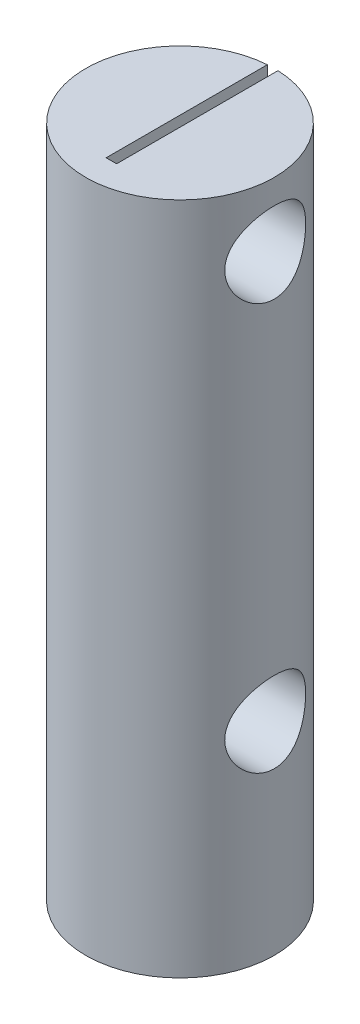
ISO-10303-21;
HEADER;
FILE_DESCRIPTION(('STEP AP214'),'2;1');
FILE_NAME('part.step','',(''),(''),'','','');
FILE_SCHEMA(('AUTOMOTIVE_DESIGN { 1 0 10303 214 1 1 1 1 }'));
ENDSEC;
DATA;
#1=APPLICATION_CONTEXT('core data for automotive mechanical design processes');
#2=APPLICATION_PROTOCOL_DEFINITION('international standard','automotive_design',2000,#1);
#3=PRODUCT_CONTEXT('',#1,'mechanical');
#4=PRODUCT('Part','Part','',(#3));
#5=PRODUCT_RELATED_PRODUCT_CATEGORY('part','',(#4));
#6=PRODUCT_DEFINITION_FORMATION('','',#4);
#7=PRODUCT_DEFINITION_CONTEXT('part definition',#1,'design');
#8=PRODUCT_DEFINITION('design','',#6,#7);
#9=PRODUCT_DEFINITION_SHAPE('','',#8);
#10=(LENGTH_UNIT() NAMED_UNIT(*) SI_UNIT(.MILLI.,.METRE.));
#11=(NAMED_UNIT(*) PLANE_ANGLE_UNIT() SI_UNIT($,.RADIAN.));
#12=(NAMED_UNIT(*) SI_UNIT($,.STERADIAN.) SOLID_ANGLE_UNIT());
#13=UNCERTAINTY_MEASURE_WITH_UNIT(LENGTH_MEASURE(1.E-05),#10,'distance_accuracy_value','');
#14=(GEOMETRIC_REPRESENTATION_CONTEXT(3) GLOBAL_UNCERTAINTY_ASSIGNED_CONTEXT((#13)) GLOBAL_UNIT_ASSIGNED_CONTEXT((#10,
#11,#12)) REPRESENTATION_CONTEXT('',''));
#15=CARTESIAN_POINT('',(0.,0.,0.));
#16=DIRECTION('',(0.,0.,1.));
#17=DIRECTION('',(1.,0.,0.));
#18=AXIS2_PLACEMENT_3D('',#15,#16,#17);
#19=CARTESIAN_POINT('',(0.,50.,0.));
#20=DIRECTION('',(0.,-1.,0.));
#21=DIRECTION('',(0.,0.,-1.));
#22=AXIS2_PLACEMENT_3D('',#19,#20,#21);
#23=CYLINDRICAL_SURFACE('',#22,7.);
#24=CARTESIAN_POINT('',(0.,50.,0.));
#25=DIRECTION('',(0.,1.,0.));
#26=DIRECTION('',(0.,0.,1.));
#27=AXIS2_PLACEMENT_3D('',#24,#25,#26);
#28=CIRCLE('',#27,7.);
#29=CARTESIAN_POINT('',(-0.499999999999999,50.,-6.98212002188447));
#30=VERTEX_POINT('',#29);
#31=CARTESIAN_POINT('',(0.27608075124194,50.,-6.99455355392992));
#32=VERTEX_POINT('',#31);
#33=EDGE_CURVE('E104',#30,#32,#28,.T.);
#34=ORIENTED_EDGE('',*,*,#33,.F.);
#35=DIRECTION('',(0.,-1.,0.));
#36=VECTOR('',#35,1.);
#37=CARTESIAN_POINT('',(-0.499999999999999,50.,-6.98212002188447));
#38=LINE('',#37,#36);
#39=CARTESIAN_POINT('',(-0.499999999999999,0.,-6.98212002188447));
#40=VERTEX_POINT('',#39);
#41=EDGE_CURVE('E79',#30,#40,#38,.T.);
#42=ORIENTED_EDGE('',*,*,#41,.T.);
#43=CARTESIAN_POINT('',(0.,0.,0.));
#44=DIRECTION('',(0.,1.,0.));
#45=DIRECTION('',(0.,0.,1.));
#46=AXIS2_PLACEMENT_3D('',#43,#44,#45);
#47=CIRCLE('',#46,7.);
#48=CARTESIAN_POINT('',(0.27608075124194,0.,-6.99455355392992));
#49=VERTEX_POINT('',#48);
#50=EDGE_CURVE('E103',#40,#49,#47,.T.);
#51=ORIENTED_EDGE('',*,*,#50,.T.);
#52=DIRECTION('',(0.,-1.,0.));
#53=VECTOR('',#52,1.);
#54=CARTESIAN_POINT('',(0.27608075124194,50.,-6.99455355392992));
#55=LINE('',#54,#53);
#56=EDGE_CURVE('E98',#49,#32,#55,.F.);
#57=ORIENTED_EDGE('',*,*,#56,.T.);
#58=EDGE_LOOP('',(#34,#42,#51,#57));
#59=FACE_BOUND('',#58,.T.);
#60=CARTESIAN_POINT('',(-6.32326286388966,15.,3.00272322303504));
#61=CARTESIAN_POINT('',(-6.32326378315434,15.0797912896545,3.00272226818639));
#62=CARTESIAN_POINT('',(-6.32478146533273,15.1596118809787,2.99953311878725));
#63=CARTESIAN_POINT('',(-6.33079257859421,15.3186489963649,2.98682183299326));
#64=CARTESIAN_POINT('',(-6.33528790539103,15.3978651030629,2.97729566212505));
#65=CARTESIAN_POINT('',(-6.3530650917198,15.6340131467418,2.93928786779487));
#66=CARTESIAN_POINT('',(-6.37063756968942,15.7892250157486,2.90137729599567));
#67=CARTESIAN_POINT('',(-6.4148385436042,16.0897370264084,2.8022707548614));
#68=CARTESIAN_POINT('',(-6.44142856736231,16.2350761780639,2.74117357847268));
#69=CARTESIAN_POINT('',(-6.500603693556,16.5134371194853,2.59772153198398));
#70=CARTESIAN_POINT('',(-6.5331876198883,16.6464613179654,2.5153708309034));
#71=CARTESIAN_POINT('',(-6.60308877829957,16.9052311786623,2.32593830900264));
#72=CARTESIAN_POINT('',(-6.64057262682859,17.0300634835517,2.21767051747863));
#73=CARTESIAN_POINT('',(-6.71469078358872,17.2604816202512,1.98196508960753));
#74=CARTESIAN_POINT('',(-6.7513247470996,17.3660597575485,1.8545198263684));
#75=CARTESIAN_POINT('',(-6.82166586264291,17.5597335426098,1.57680138342897));
#76=CARTESIAN_POINT('',(-6.85515750379873,17.6467870960987,1.4257419236761));
#77=CARTESIAN_POINT('',(-6.91339082241381,17.7938478518043,1.10942612751776));
#78=CARTESIAN_POINT('',(-6.93813659272704,17.8538677087488,0.944176476898538));
#79=CARTESIAN_POINT('',(-6.97491347834318,17.9418124036036,0.61374680879481));
#80=CARTESIAN_POINT('',(-6.9875654805161,17.9713118175719,0.449056411400292));
#81=CARTESIAN_POINT('',(-7.00100203651558,18.0024770344066,0.116610327718632));
#82=CARTESIAN_POINT('',(-7.00179171329503,18.0041548525487,-0.0511440040136647));
#83=CARTESIAN_POINT('',(-6.99177277513283,17.9804249911638,-0.373428597075082));
#84=CARTESIAN_POINT('',(-6.98170819836005,17.956755554903,-0.528114471296276));
#85=CARTESIAN_POINT('',(-6.95215731198996,17.8859983254415,-0.831073500655528));
#86=CARTESIAN_POINT('',(-6.93267031115006,17.8389088141032,-0.979346184443139));
#87=CARTESIAN_POINT('',(-6.88577735894948,17.7221150794459,-1.26798767380358));
#88=CARTESIAN_POINT('',(-6.85825583387804,17.6520788364832,-1.40820257797709));
#89=CARTESIAN_POINT('',(-6.79796108187211,17.4917177145317,-1.67525969213018));
#90=CARTESIAN_POINT('',(-6.76518597214793,17.4013855571745,-1.80209708072876));
#91=CARTESIAN_POINT('',(-6.69479048985917,17.1952476046488,-2.04876226096162));
#92=CARTESIAN_POINT('',(-6.65699104415712,17.0780528434205,-2.16737980999052));
#93=CARTESIAN_POINT('',(-6.58259238611411,16.8254025458965,-2.38382119963024));
#94=CARTESIAN_POINT('',(-6.54599369712514,16.6899391752697,-2.4816360725643));
#95=CARTESIAN_POINT('',(-6.47682120801458,16.3983816856667,-2.65707048589437));
#96=CARTESIAN_POINT('',(-6.44444316942739,16.241714863924,-2.73382219709668));
#97=CARTESIAN_POINT('',(-6.38974480684829,15.9159286768116,-2.85935390433064));
#98=CARTESIAN_POINT('',(-6.36741683466148,15.7468188950728,-2.90815517863915));
#99=CARTESIAN_POINT('',(-6.3372798087362,15.4130765360986,-2.97322966393146));
#100=CARTESIAN_POINT('',(-6.32859493106654,15.2489083212291,-2.99147059646765));
#101=CARTESIAN_POINT('',(-6.32421968898995,14.9196619929362,-3.00071449565785));
#102=CARTESIAN_POINT('',(-6.32852438110462,14.7545842495233,-2.99172782439506));
#103=CARTESIAN_POINT('',(-6.34873302314869,14.4402859046611,-2.9485713391566));
#104=CARTESIAN_POINT('',(-6.3638118925518,14.2907595210896,-2.91619112946264));
#105=CARTESIAN_POINT('',(-6.40279141976494,13.999403516592,-2.82957599799855));
#106=CARTESIAN_POINT('',(-6.42669421850103,13.8575757731533,-2.77533577209872));
#107=CARTESIAN_POINT('',(-6.48188552590026,13.5787537793978,-2.64394242194293));
#108=CARTESIAN_POINT('',(-6.51344947941061,13.4422362094036,-2.56589729149866));
#109=CARTESIAN_POINT('',(-6.58003337440752,13.1835557673391,-2.38997869042985));
#110=CARTESIAN_POINT('',(-6.61505486533699,13.0613993852311,-2.29209630916704));
#111=CARTESIAN_POINT('',(-6.68827581588288,12.8238514691411,-2.06926631665099));
#112=CARTESIAN_POINT('',(-6.72648697354915,12.7099702661524,-1.94270591066993));
#113=CARTESIAN_POINT('',(-6.79897677450606,12.5047636212234,-1.67140952707088));
#114=CARTESIAN_POINT('',(-6.83325502815704,12.4134404131117,-1.52667175155937));
#115=CARTESIAN_POINT('',(-6.89432479209561,12.2558485112159,-1.22170095280638));
#116=CARTESIAN_POINT('',(-6.92107958727478,12.1897021465899,-1.06139690704243));
#117=CARTESIAN_POINT('',(-6.96377353791193,12.0858242717744,-0.73048863357864));
#118=CARTESIAN_POINT('',(-6.97971953966757,12.0480747733224,-0.559891000567304));
#119=CARTESIAN_POINT('',(-6.99817059776532,12.00441996817,-0.226711607260602));
#120=CARTESIAN_POINT('',(-7.00157374116683,11.996386761269,-0.0644566574853799));
#121=CARTESIAN_POINT('',(-6.997073869522,12.0065952376713,0.259046171665985));
#122=CARTESIAN_POINT('',(-6.9891730366938,12.0248318496243,0.420294239384294));
#123=CARTESIAN_POINT('',(-6.963434090249,12.0855369016493,0.730700780154835));
#124=CARTESIAN_POINT('',(-6.94599561815234,12.1270323913988,0.880085485827085));
#125=CARTESIAN_POINT('',(-6.90313487728844,12.2319824279208,1.1696912163942));
#126=CARTESIAN_POINT('',(-6.87771113609789,12.2954410247446,1.30991054549742));
#127=CARTESIAN_POINT('',(-6.81986821037176,12.4457391720343,1.58428371030018));
#128=CARTESIAN_POINT('',(-6.78718225099332,12.5335153780417,1.7178667771632));
#129=CARTESIAN_POINT('',(-6.71863505514397,12.7286336383767,1.96898810440127));
#130=CARTESIAN_POINT('',(-6.68277256320433,12.8359834467305,2.08651997375304));
#131=CARTESIAN_POINT('',(-6.60861837374977,13.0763507883284,2.31109260863649));
#132=CARTESIAN_POINT('',(-6.57033953914823,13.2106667101791,2.41675024864069));
#133=CARTESIAN_POINT('',(-6.49828904456149,13.4963533256694,2.60430013882765));
#134=CARTESIAN_POINT('',(-6.46452001206481,13.6477338675645,2.68617856717813));
#135=CARTESIAN_POINT('',(-6.42053526852075,13.8844307784929,2.7889251642932));
#136=CARTESIAN_POINT('',(-6.40698833087529,13.9649075867447,2.81982236673246));
#137=CARTESIAN_POINT('',(-6.38257011545701,14.1285759441178,2.87466573554698));
#138=CARTESIAN_POINT('',(-6.37169751453675,14.2117661276083,2.89861534035282));
#139=CARTESIAN_POINT('',(-6.35306374282358,14.3800043271867,2.93923109000154));
#140=CARTESIAN_POINT('',(-6.34529437526487,14.4650468148595,2.95591643304358));
#141=CARTESIAN_POINT('',(-6.33313829294579,14.6364516699032,2.9818731454383));
#142=CARTESIAN_POINT('',(-6.32874898440049,14.7228129732355,2.99115019995573));
#143=CARTESIAN_POINT('',(-6.32517996467578,14.8411445195379,2.99868324610555));
#144=CARTESIAN_POINT('',(-6.32446164184328,14.8728908029643,3.00019769857171));
#145=CARTESIAN_POINT('',(-6.32350290448429,14.9364231733768,3.00221788535343));
#146=CARTESIAN_POINT('',(-6.32326249763284,14.968209260994,3.00272360346935));
#147=CARTESIAN_POINT('',(-6.32326286388966,15.,3.00272322303504));
#148=B_SPLINE_CURVE_WITH_KNOTS('',3,(#60,#61,#62,#63,#64,#65,#66,#67,#68,#69,#70,#71,#72,#73,
#74,#75,#76,#77,#78,#79,#80,#81,#82,#83,#84,#85,#86,#87,#88,#89,#90,#91,#92,#93,#94,#95,#96,#97,
#98,#99,#100,#101,#102,#103,#104,#105,#106,#107,#108,#109,#110,#111,#112,#113,#114,#115,#116,
#117,#118,#119,#120,#121,#122,#123,#124,#125,#126,#127,#128,#129,#130,#131,#132,#133,#134,#135,
#136,#137,#138,#139,#140,#141,#142,#143,#144,#145,#146,#147),.UNSPECIFIED.,.T.,.F.,(4,2,2,2,2,2,
2,2,2,2,2,2,2,2,2,2,2,2,2,2,2,2,2,2,2,2,2,2,2,2,2,2,2,2,2,2,2,2,2,2,2,2,2,4),(0.,
0.239338244887283,0.478829010811593,0.958460945018812,1.43607181036892,1.91358906030128,
2.4197112565315,2.92603527246616,3.45591952851075,3.98555548229669,4.48625015142358,
4.98672858057274,5.45495951464113,5.92322480401723,6.39858906115766,6.87412406271998,
7.38479275075876,7.89568113508067,8.42522415338773,8.95436350031238,9.44789955511443,
9.94124780715423,10.4003836153743,10.8596308957659,11.3388032299623,11.8181912811821,
12.3392379542931,12.8603362039152,13.3839349896902,13.9072018169267,14.3921818903264,
14.8770683515757,15.3430410061853,15.8090996331255,16.2964751312754,16.7840441229666,
17.3070458065871,17.8303508829182,18.0918408955747,18.3532012727434,18.6138666631023,
18.8743318245369,18.9696883167252,19.0650463402678),.UNSPECIFIED.);
#149=CARTESIAN_POINT('',(-6.32326286388966,15.,3.00272322303504));
#150=VERTEX_POINT('',#149);
#151=EDGE_CURVE('E117',#150,#150,#148,.T.);
#152=ORIENTED_EDGE('',*,*,#151,.F.);
#153=EDGE_LOOP('',(#152));
#154=FACE_BOUND('',#153,.T.);
#155=CARTESIAN_POINT('',(6.32326286388966,15.,3.00272322303504));
#156=CARTESIAN_POINT('',(6.32326378315434,14.9202087103455,3.00272226818639));
#157=CARTESIAN_POINT('',(6.32478146533273,14.8403881190213,2.99953311878725));
#158=CARTESIAN_POINT('',(6.33079257859421,14.6813510036351,2.98682183299326));
#159=CARTESIAN_POINT('',(6.33528790539103,14.6021348969371,2.97729566212505));
#160=CARTESIAN_POINT('',(6.3530650917198,14.3659868532581,2.93928786779487));
#161=CARTESIAN_POINT('',(6.37063756968942,14.2107749842514,2.90137729599567));
#162=CARTESIAN_POINT('',(6.4148385436042,13.9102629735916,2.8022707548614));
#163=CARTESIAN_POINT('',(6.44142856736231,13.764923821936,2.74117357847268));
#164=CARTESIAN_POINT('',(6.500603693556,13.4865628805147,2.59772153198398));
#165=CARTESIAN_POINT('',(6.5331876198883,13.3535386820346,2.5153708309034));
#166=CARTESIAN_POINT('',(6.60308877829957,13.0947688213377,2.32593830900264));
#167=CARTESIAN_POINT('',(6.64057262682859,12.9699365164483,2.21767051747863));
#168=CARTESIAN_POINT('',(6.71469078358872,12.7395183797488,1.98196508960753));
#169=CARTESIAN_POINT('',(6.7513247470996,12.6339402424515,1.8545198263684));
#170=CARTESIAN_POINT('',(6.82166586264291,12.4402664573902,1.57680138342897));
#171=CARTESIAN_POINT('',(6.85515750379873,12.3532129039013,1.4257419236761));
#172=CARTESIAN_POINT('',(6.91339082241381,12.2061521481957,1.10942612751776));
#173=CARTESIAN_POINT('',(6.93813659272704,12.1461322912512,0.944176476898537));
#174=CARTESIAN_POINT('',(6.97491347834318,12.0581875963964,0.613746808794809));
#175=CARTESIAN_POINT('',(6.9875654805161,12.0286881824281,0.449056411400291));
#176=CARTESIAN_POINT('',(7.00100203651558,11.9975229655934,0.116610327718632));
#177=CARTESIAN_POINT('',(7.00179171329503,11.9958451474513,-0.051144004013664));
#178=CARTESIAN_POINT('',(6.99177277513283,12.0195750088362,-0.373428597075081));
#179=CARTESIAN_POINT('',(6.98170819836005,12.043244445097,-0.528114471296275));
#180=CARTESIAN_POINT('',(6.95215731198996,12.1140016745585,-0.831073500655528));
#181=CARTESIAN_POINT('',(6.93267031115006,12.1610911858968,-0.979346184443139));
#182=CARTESIAN_POINT('',(6.88577735894948,12.2778849205541,-1.26798767380358));
#183=CARTESIAN_POINT('',(6.85825583387804,12.3479211635168,-1.40820257797709));
#184=CARTESIAN_POINT('',(6.79796108187211,12.5082822854683,-1.67525969213018));
#185=CARTESIAN_POINT('',(6.76518597214793,12.5986144428255,-1.80209708072876));
#186=CARTESIAN_POINT('',(6.69479048985917,12.8047523953512,-2.04876226096162));
#187=CARTESIAN_POINT('',(6.65699104415712,12.9219471565795,-2.16737980999052));
#188=CARTESIAN_POINT('',(6.58259238611411,13.1745974541035,-2.38382119963024));
#189=CARTESIAN_POINT('',(6.54599369712514,13.3100608247303,-2.4816360725643));
#190=CARTESIAN_POINT('',(6.47682120801458,13.6016183143333,-2.65707048589437));
#191=CARTESIAN_POINT('',(6.44444316942739,13.758285136076,-2.73382219709669));
#192=CARTESIAN_POINT('',(6.38974480684829,14.0840713231884,-2.85935390433064));
#193=CARTESIAN_POINT('',(6.36741683466148,14.2531811049272,-2.90815517863915));
#194=CARTESIAN_POINT('',(6.3372798087362,14.5869234639014,-2.97322966393146));
#195=CARTESIAN_POINT('',(6.32859493106654,14.7510916787709,-2.99147059646765));
#196=CARTESIAN_POINT('',(6.32421968898995,15.0803380070638,-3.00071449565785));
#197=CARTESIAN_POINT('',(6.32852438110462,15.2454157504767,-2.99172782439506));
#198=CARTESIAN_POINT('',(6.34873302314869,15.5597140953389,-2.9485713391566));
#199=CARTESIAN_POINT('',(6.3638118925518,15.7092404789104,-2.91619112946264));
#200=CARTESIAN_POINT('',(6.40279141976494,16.0005964834079,-2.82957599799855));
#201=CARTESIAN_POINT('',(6.42669421850103,16.1424242268467,-2.77533577209872));
#202=CARTESIAN_POINT('',(6.48188552590026,16.4212462206022,-2.64394242194293));
#203=CARTESIAN_POINT('',(6.51344947941061,16.5577637905964,-2.56589729149866));
#204=CARTESIAN_POINT('',(6.58003337440752,16.8164442326609,-2.38997869042984));
#205=CARTESIAN_POINT('',(6.61505486533699,16.9386006147689,-2.29209630916704));
#206=CARTESIAN_POINT('',(6.68827581588288,17.1761485308589,-2.06926631665099));
#207=CARTESIAN_POINT('',(6.72648697354915,17.2900297338476,-1.94270591066993));
#208=CARTESIAN_POINT('',(6.79897677450606,17.4952363787766,-1.67140952707088));
#209=CARTESIAN_POINT('',(6.83325502815704,17.5865595868883,-1.52667175155937));
#210=CARTESIAN_POINT('',(6.89432479209561,17.7441514887841,-1.22170095280638));
#211=CARTESIAN_POINT('',(6.92107958727478,17.8102978534101,-1.06139690704243));
#212=CARTESIAN_POINT('',(6.96377353791193,17.9141757282256,-0.73048863357864));
#213=CARTESIAN_POINT('',(6.97971953966757,17.9519252266776,-0.559891000567304));
#214=CARTESIAN_POINT('',(6.99817059776532,17.99558003183,-0.226711607260602));
#215=CARTESIAN_POINT('',(7.00157374116683,18.003613238731,-0.0644566574853802));
#216=CARTESIAN_POINT('',(6.997073869522,17.9934047623287,0.259046171665984));
#217=CARTESIAN_POINT('',(6.9891730366938,17.9751681503757,0.420294239384293));
#218=CARTESIAN_POINT('',(6.963434090249,17.9144630983507,0.730700780154835));
#219=CARTESIAN_POINT('',(6.94599561815234,17.8729676086012,0.880085485827085));
#220=CARTESIAN_POINT('',(6.90313487728844,17.7680175720792,1.1696912163942));
#221=CARTESIAN_POINT('',(6.87771113609789,17.7045589752554,1.30991054549742));
#222=CARTESIAN_POINT('',(6.81986821037176,17.5542608279657,1.58428371030018));
#223=CARTESIAN_POINT('',(6.78718225099332,17.4664846219583,1.7178667771632));
#224=CARTESIAN_POINT('',(6.71863505514397,17.2713663616233,1.96898810440127));
#225=CARTESIAN_POINT('',(6.68277256320433,17.1640165532695,2.08651997375304));
#226=CARTESIAN_POINT('',(6.60861837374977,16.9236492116716,2.31109260863649));
#227=CARTESIAN_POINT('',(6.57033953914823,16.7893332898209,2.41675024864069));
#228=CARTESIAN_POINT('',(6.4982890445615,16.5036466743306,2.60430013882765));
#229=CARTESIAN_POINT('',(6.46452001206481,16.3522661324355,2.68617856717813));
#230=CARTESIAN_POINT('',(6.42053526852075,16.1155692215071,2.7889251642932));
#231=CARTESIAN_POINT('',(6.40698833087529,16.0350924132553,2.81982236673246));
#232=CARTESIAN_POINT('',(6.38257011545701,15.8714240558822,2.87466573554698));
#233=CARTESIAN_POINT('',(6.37169751453675,15.7882338723917,2.89861534035282));
#234=CARTESIAN_POINT('',(6.35306374282358,15.6199956728133,2.93923109000154));
#235=CARTESIAN_POINT('',(6.34529437526487,15.5349531851405,2.95591643304358));
#236=CARTESIAN_POINT('',(6.33313829294579,15.3635483300968,2.9818731454383));
#237=CARTESIAN_POINT('',(6.32874898440049,15.2771870267645,2.99115019995573));
#238=CARTESIAN_POINT('',(6.32517996467578,15.1588554804621,2.99868324610555));
#239=CARTESIAN_POINT('',(6.32446164184328,15.1271091970357,3.00019769857171));
#240=CARTESIAN_POINT('',(6.32350290448429,15.0635768266232,3.00221788535343));
#241=CARTESIAN_POINT('',(6.32326249763284,15.031790739006,3.00272360346935));
#242=CARTESIAN_POINT('',(6.32326286388966,15.,3.00272322303504));
#243=B_SPLINE_CURVE_WITH_KNOTS('',3,(#155,#156,#157,#158,#159,#160,#161,#162,#163,#164,#165,
#166,#167,#168,#169,#170,#171,#172,#173,#174,#175,#176,#177,#178,#179,#180,#181,#182,#183,#184,
#185,#186,#187,#188,#189,#190,#191,#192,#193,#194,#195,#196,#197,#198,#199,#200,#201,#202,#203,
#204,#205,#206,#207,#208,#209,#210,#211,#212,#213,#214,#215,#216,#217,#218,#219,#220,#221,#222,
#223,#224,#225,#226,#227,#228,#229,#230,#231,#232,#233,#234,#235,#236,#237,#238,#239,#240,#241,
#242),.UNSPECIFIED.,.T.,.F.,(4,2,2,2,2,2,2,2,2,2,2,2,2,2,2,2,2,2,2,2,2,2,2,2,2,2,2,2,2,2,2,2,2,
2,2,2,2,2,2,2,2,2,2,4),(0.,0.239338244887283,0.478829010811593,0.958460945018812,
1.43607181036892,1.91358906030127,2.4197112565315,2.92603527246616,3.45591952851075,
3.98555548229669,4.48625015142358,4.98672858057274,5.45495951464113,5.92322480401723,
6.39858906115766,6.87412406271998,7.38479275075876,7.89568113508067,8.42522415338774,
8.95436350031238,9.44789955511443,9.94124780715423,10.4003836153743,10.8596308957659,
11.3388032299623,11.8181912811821,12.3392379542931,12.8603362039152,13.3839349896902,
13.9072018169267,14.3921818903264,14.8770683515757,15.3430410061853,15.8090996331255,
16.2964751312754,16.7840441229666,17.3070458065871,17.8303508829182,18.0918408955747,
18.3532012727434,18.6138666631023,18.8743318245369,18.9696883167252,19.0650463402678),.UNSPECIFIED.);
#244=CARTESIAN_POINT('',(6.32326286388966,15.,3.00272322303504));
#245=VERTEX_POINT('',#244);
#246=EDGE_CURVE('E85',#245,#245,#243,.T.);
#247=ORIENTED_EDGE('',*,*,#246,.F.);
#248=EDGE_LOOP('',(#247));
#249=FACE_BOUND('',#248,.T.);
#250=CARTESIAN_POINT('',(-6.32326286388966,45.179912014064,3.00272322303504));
#251=CARTESIAN_POINT('',(-6.32326378315434,45.2597033037185,3.00272226818639));
#252=CARTESIAN_POINT('',(-6.32478146533273,45.3395238950427,2.99953311878725));
#253=CARTESIAN_POINT('',(-6.33079257859421,45.4985610104289,2.98682183299326));
#254=CARTESIAN_POINT('',(-6.33528790539103,45.5777771171269,2.97729566212505));
#255=CARTESIAN_POINT('',(-6.3530650917198,45.8139251608059,2.93928786779487));
#256=CARTESIAN_POINT('',(-6.37063756968942,45.9691370298126,2.90137729599567));
#257=CARTESIAN_POINT('',(-6.4148385436042,46.2696490404724,2.8022707548614));
#258=CARTESIAN_POINT('',(-6.44142856736231,46.414988192128,2.74117357847269));
#259=CARTESIAN_POINT('',(-6.500603693556,46.6933491335494,2.59772153198398));
#260=CARTESIAN_POINT('',(-6.5331876198883,46.8263733320294,2.5153708309034));
#261=CARTESIAN_POINT('',(-6.60308877829957,47.0851431927263,2.32593830900264));
#262=CARTESIAN_POINT('',(-6.64057262682859,47.2099754976158,2.21767051747863));
#263=CARTESIAN_POINT('',(-6.71469078358872,47.4403936343152,1.98196508960753));
#264=CARTESIAN_POINT('',(-6.75132474709961,47.5459717716126,1.85451982636839));
#265=CARTESIAN_POINT('',(-6.82166586264291,47.7396455566738,1.57680138342896));
#266=CARTESIAN_POINT('',(-6.85515750379873,47.8266991101627,1.42574192367609));
#267=CARTESIAN_POINT('',(-6.91339082241381,47.9737598658683,1.10942612751775));
#268=CARTESIAN_POINT('',(-6.93813659272704,48.0337797228129,0.94417647689853));
#269=CARTESIAN_POINT('',(-6.97491347834319,48.1217244176676,0.613746808794803));
#270=CARTESIAN_POINT('',(-6.9875654805161,48.151223831636,0.449056411400286));
#271=CARTESIAN_POINT('',(-7.00100203651558,48.1823890484707,0.116610327718628));
#272=CARTESIAN_POINT('',(-7.00179171329503,48.1840668666127,-0.0511440040136678));
#273=CARTESIAN_POINT('',(-6.99177277513283,48.1603370052278,-0.373428597075084));
#274=CARTESIAN_POINT('',(-6.98170819836005,48.136667568967,-0.528114471296278));
#275=CARTESIAN_POINT('',(-6.95215731198996,48.0659103395056,-0.83107350065553));
#276=CARTESIAN_POINT('',(-6.93267031115006,48.0188208281673,-0.979346184443142));
#277=CARTESIAN_POINT('',(-6.88577735894948,47.9020270935099,-1.26798767380358));
#278=CARTESIAN_POINT('',(-6.85825583387804,47.8319908505473,-1.40820257797709));
#279=CARTESIAN_POINT('',(-6.79796108187211,47.6716297285957,-1.67525969213018));
#280=CARTESIAN_POINT('',(-6.76518597214793,47.5812975712385,-1.80209708072877));
#281=CARTESIAN_POINT('',(-6.69479048985917,47.3751596187128,-2.04876226096163));
#282=CARTESIAN_POINT('',(-6.65699104415711,47.2579648574845,-2.16737980999052));
#283=CARTESIAN_POINT('',(-6.58259238611411,47.0053145599605,-2.38382119963024));
#284=CARTESIAN_POINT('',(-6.54599369712514,46.8698511893337,-2.4816360725643));
#285=CARTESIAN_POINT('',(-6.47682120801458,46.5782936997307,-2.65707048589437));
#286=CARTESIAN_POINT('',(-6.44444316942739,46.421626877988,-2.73382219709668));
#287=CARTESIAN_POINT('',(-6.38974480684829,46.0958406908756,-2.85935390433064));
#288=CARTESIAN_POINT('',(-6.36741683466148,45.9267309091369,-2.90815517863915));
#289=CARTESIAN_POINT('',(-6.3372798087362,45.5929885501627,-2.97322966393146));
#290=CARTESIAN_POINT('',(-6.32859493106654,45.4288203352932,-2.99147059646765));
#291=CARTESIAN_POINT('',(-6.32421968898995,45.0995740070003,-3.00071449565785));
#292=CARTESIAN_POINT('',(-6.32852438110462,44.9344962635874,-2.99172782439506));
#293=CARTESIAN_POINT('',(-6.34873302314869,44.6201979187252,-2.9485713391566));
#294=CARTESIAN_POINT('',(-6.3638118925518,44.4706715351536,-2.91619112946264));
#295=CARTESIAN_POINT('',(-6.40279141976494,44.1793155306561,-2.82957599799855));
#296=CARTESIAN_POINT('',(-6.42669421850103,44.0374877872173,-2.77533577209872));
#297=CARTESIAN_POINT('',(-6.48188552590026,43.7586657934618,-2.64394242194292));
#298=CARTESIAN_POINT('',(-6.51344947941061,43.6221482234676,-2.56589729149866));
#299=CARTESIAN_POINT('',(-6.58003337440752,43.3634677814032,-2.38997869042984));
#300=CARTESIAN_POINT('',(-6.61505486533699,43.2413113992951,-2.29209630916704));
#301=CARTESIAN_POINT('',(-6.68827581588288,43.0037634832051,-2.06926631665099));
#302=CARTESIAN_POINT('',(-6.72648697354915,42.8898822802164,-1.94270591066994));
#303=CARTESIAN_POINT('',(-6.79897677450606,42.6846756352875,-1.67140952707088));
#304=CARTESIAN_POINT('',(-6.83325502815703,42.5933524271757,-1.52667175155937));
#305=CARTESIAN_POINT('',(-6.89432479209561,42.4357605252799,-1.22170095280638));
#306=CARTESIAN_POINT('',(-6.92107958727478,42.3696141606539,-1.06139690704243));
#307=CARTESIAN_POINT('',(-6.96377353791193,42.2657362858384,-0.730488633578639));
#308=CARTESIAN_POINT('',(-6.97971953966757,42.2279867873864,-0.559891000567303));
#309=CARTESIAN_POINT('',(-6.99817059776532,42.184331982234,-0.2267116072606));
#310=CARTESIAN_POINT('',(-7.00157374116683,42.1762987753331,-0.0644566574853777));
#311=CARTESIAN_POINT('',(-6.997073869522,42.1865072517353,0.259046171665987));
#312=CARTESIAN_POINT('',(-6.9891730366938,42.2047438636883,0.420294239384296));
#313=CARTESIAN_POINT('',(-6.963434090249,42.2654489157133,0.730700780154838));
#314=CARTESIAN_POINT('',(-6.94599561815234,42.3069444054628,0.880085485827088));
#315=CARTESIAN_POINT('',(-6.90313487728844,42.4118944419849,1.1696912163942));
#316=CARTESIAN_POINT('',(-6.87771113609788,42.4753530388086,1.30991054549743));
#317=CARTESIAN_POINT('',(-6.81986821037176,42.6256511860984,1.58428371030018));
#318=CARTESIAN_POINT('',(-6.78718225099332,42.7134273921057,1.7178667771632));
#319=CARTESIAN_POINT('',(-6.71863505514397,42.9085456524407,1.96898810440128));
#320=CARTESIAN_POINT('',(-6.68277256320433,43.0158954607946,2.08651997375304));
#321=CARTESIAN_POINT('',(-6.60861837374977,43.2562628023925,2.31109260863649));
#322=CARTESIAN_POINT('',(-6.57033953914823,43.3905787242431,2.41675024864069));
#323=CARTESIAN_POINT('',(-6.49828904456149,43.6762653397334,2.60430013882765));
#324=CARTESIAN_POINT('',(-6.46452001206481,43.8276458816285,2.68617856717814));
#325=CARTESIAN_POINT('',(-6.42053526852075,44.0643427925569,2.7889251642932));
#326=CARTESIAN_POINT('',(-6.40698833087529,44.1448196008087,2.81982236673246));
#327=CARTESIAN_POINT('',(-6.38257011545701,44.3084879581818,2.87466573554698));
#328=CARTESIAN_POINT('',(-6.37169751453675,44.3916781416723,2.89861534035282));
#329=CARTESIAN_POINT('',(-6.35306374282358,44.5599163412507,2.93923109000154));
#330=CARTESIAN_POINT('',(-6.34529437526487,44.6449588289235,2.95591643304358));
#331=CARTESIAN_POINT('',(-6.33313829294579,44.8163636839672,2.9818731454383));
#332=CARTESIAN_POINT('',(-6.32874898440049,44.9027249872995,2.99115019995574));
#333=CARTESIAN_POINT('',(-6.32517996467578,45.0210565336019,2.99868324610555));
#334=CARTESIAN_POINT('',(-6.32446164184328,45.0528028170283,3.00019769857171));
#335=CARTESIAN_POINT('',(-6.32350290448429,45.1163351874408,3.00221788535343));
#336=CARTESIAN_POINT('',(-6.32326249763284,45.148121275058,3.00272360346935));
#337=CARTESIAN_POINT('',(-6.32326286388966,45.179912014064,3.00272322303504));
#338=B_SPLINE_CURVE_WITH_KNOTS('',3,(#250,#251,#252,#253,#254,#255,#256,#257,#258,#259,#260,
#261,#262,#263,#264,#265,#266,#267,#268,#269,#270,#271,#272,#273,#274,#275,#276,#277,#278,#279,
#280,#281,#282,#283,#284,#285,#286,#287,#288,#289,#290,#291,#292,#293,#294,#295,#296,#297,#298,
#299,#300,#301,#302,#303,#304,#305,#306,#307,#308,#309,#310,#311,#312,#313,#314,#315,#316,#317,
#318,#319,#320,#321,#322,#323,#324,#325,#326,#327,#328,#329,#330,#331,#332,#333,#334,#335,#336,
#337),.UNSPECIFIED.,.T.,.F.,(4,2,2,2,2,2,2,2,2,2,2,2,2,2,2,2,2,2,2,2,2,2,2,2,2,2,2,2,2,2,2,2,2,
2,2,2,2,2,2,2,2,2,2,4),(0.,0.239338244887285,0.478829010811599,0.958460945018816,
1.43607181036892,1.91358906030128,2.41971125653151,2.92603527246617,3.45591952851076,
3.9855554822967,4.48625015142359,4.98672858057275,5.45495951464113,5.92322480401724,
6.39858906115767,6.87412406271999,7.38479275075877,7.89568113508068,8.42522415338773,
8.95436350031239,9.44789955511444,9.94124780715424,10.4003836153743,10.8596308957659,
11.3388032299623,11.8181912811822,12.3392379542931,12.8603362039152,13.3839349896903,
13.9072018169267,14.3921818903264,14.8770683515757,15.3430410061853,15.8090996331255,
16.2964751312754,16.7840441229666,17.3070458065871,17.8303508829182,18.0918408955747,
18.3532012727435,18.6138666631023,18.8743318245369,18.9696883167252,19.0650463402678),.UNSPECIFIED.);
#339=CARTESIAN_POINT('',(-6.32326286388966,45.179912014064,3.00272322303504));
#340=VERTEX_POINT('',#339);
#341=EDGE_CURVE('E120',#340,#340,#338,.T.);
#342=ORIENTED_EDGE('',*,*,#341,.F.);
#343=EDGE_LOOP('',(#342));
#344=FACE_BOUND('',#343,.T.);
#345=CARTESIAN_POINT('',(6.32326286388966,45.179912014064,3.00272322303504));
#346=CARTESIAN_POINT('',(6.32326378315434,45.1001207244095,3.00272226818639));
#347=CARTESIAN_POINT('',(6.32478146533273,45.0203001330853,2.99953311878725));
#348=CARTESIAN_POINT('',(6.33079257859421,44.8612630176991,2.98682183299326));
#349=CARTESIAN_POINT('',(6.33528790539103,44.7820469110012,2.97729566212505));
#350=CARTESIAN_POINT('',(6.3530650917198,44.5458988673222,2.93928786779487));
#351=CARTESIAN_POINT('',(6.37063756968942,44.3906869983155,2.90137729599567));
#352=CARTESIAN_POINT('',(6.4148385436042,44.0901749876557,2.8022707548614));
#353=CARTESIAN_POINT('',(6.44142856736231,43.9448358360001,2.74117357847269));
#354=CARTESIAN_POINT('',(6.500603693556,43.6664748945787,2.59772153198398));
#355=CARTESIAN_POINT('',(6.5331876198883,43.5334506960986,2.5153708309034));
#356=CARTESIAN_POINT('',(6.60308877829957,43.2746808354017,2.32593830900264));
#357=CARTESIAN_POINT('',(6.64057262682859,43.1498485305123,2.21767051747863));
#358=CARTESIAN_POINT('',(6.71469078358872,42.9194303938129,1.98196508960753));
#359=CARTESIAN_POINT('',(6.7513247470996,42.8138522565155,1.8545198263684));
#360=CARTESIAN_POINT('',(6.82166586264291,42.6201784714543,1.57680138342896));
#361=CARTESIAN_POINT('',(6.85515750379873,42.5331249179653,1.42574192367609));
#362=CARTESIAN_POINT('',(6.91339082241381,42.3860641622598,1.10942612751775));
#363=CARTESIAN_POINT('',(6.93813659272704,42.3260443053152,0.94417647689853));
#364=CARTESIAN_POINT('',(6.97491347834319,42.2380996104605,0.613746808794803));
#365=CARTESIAN_POINT('',(6.9875654805161,42.2086001964921,0.449056411400286));
#366=CARTESIAN_POINT('',(7.00100203651558,42.1774349796574,0.116610327718628));
#367=CARTESIAN_POINT('',(7.00179171329503,42.1757571615154,-0.0511440040136678));
#368=CARTESIAN_POINT('',(6.99177277513283,42.1994870229003,-0.373428597075084));
#369=CARTESIAN_POINT('',(6.98170819836005,42.223156459161,-0.528114471296278));
#370=CARTESIAN_POINT('',(6.95215731198996,42.2939136886225,-0.83107350065553));
#371=CARTESIAN_POINT('',(6.93267031115006,42.3410031999608,-0.979346184443142));
#372=CARTESIAN_POINT('',(6.88577735894948,42.4577969346182,-1.26798767380358));
#373=CARTESIAN_POINT('',(6.85825583387804,42.5278331775808,-1.4082025779771));
#374=CARTESIAN_POINT('',(6.79796108187211,42.6881942995323,-1.67525969213018));
#375=CARTESIAN_POINT('',(6.76518597214793,42.7785264568896,-1.80209708072877));
#376=CARTESIAN_POINT('',(6.69479048985917,42.9846644094152,-2.04876226096163));
#377=CARTESIAN_POINT('',(6.65699104415711,43.1018591706436,-2.16737980999052));
#378=CARTESIAN_POINT('',(6.58259238611411,43.3545094681675,-2.38382119963024));
#379=CARTESIAN_POINT('',(6.54599369712514,43.4899728387944,-2.4816360725643));
#380=CARTESIAN_POINT('',(6.47682120801458,43.7815303283973,-2.65707048589437));
#381=CARTESIAN_POINT('',(6.44444316942739,43.93819715014,-2.73382219709669));
#382=CARTESIAN_POINT('',(6.38974480684829,44.2639833372525,-2.85935390433065));
#383=CARTESIAN_POINT('',(6.36741683466148,44.4330931189912,-2.90815517863915));
#384=CARTESIAN_POINT('',(6.3372798087362,44.7668354779654,-2.97322966393146));
#385=CARTESIAN_POINT('',(6.32859493106654,44.9310036928349,-2.99147059646765));
#386=CARTESIAN_POINT('',(6.32421968898995,45.2602500211278,-3.00071449565785));
#387=CARTESIAN_POINT('',(6.32852438110462,45.4253277645407,-2.99172782439506));
#388=CARTESIAN_POINT('',(6.34873302314869,45.7396261094029,-2.9485713391566));
#389=CARTESIAN_POINT('',(6.3638118925518,45.8891524929744,-2.91619112946264));
#390=CARTESIAN_POINT('',(6.40279141976494,46.180508497472,-2.82957599799855));
#391=CARTESIAN_POINT('',(6.42669421850103,46.3223362409108,-2.77533577209872));
#392=CARTESIAN_POINT('',(6.48188552590026,46.6011582346663,-2.64394242194292));
#393=CARTESIAN_POINT('',(6.51344947941061,46.7376758046605,-2.56589729149866));
#394=CARTESIAN_POINT('',(6.58003337440752,46.9963562467249,-2.38997869042984));
#395=CARTESIAN_POINT('',(6.61505486533699,47.118512628833,-2.29209630916704));
#396=CARTESIAN_POINT('',(6.68827581588288,47.3560605449229,-2.06926631665099));
#397=CARTESIAN_POINT('',(6.72648697354915,47.4699417479117,-1.94270591066993));
#398=CARTESIAN_POINT('',(6.79897677450606,47.6751483928406,-1.67140952707088));
#399=CARTESIAN_POINT('',(6.83325502815704,47.7664716009524,-1.52667175155936));
#400=CARTESIAN_POINT('',(6.89432479209561,47.9240635028481,-1.22170095280638));
#401=CARTESIAN_POINT('',(6.92107958727478,47.9902098674741,-1.06139690704243));
#402=CARTESIAN_POINT('',(6.96377353791193,48.0940877422896,-0.730488633578639));
#403=CARTESIAN_POINT('',(6.97971953966757,48.1318372407417,-0.559891000567303));
#404=CARTESIAN_POINT('',(6.99817059776532,48.1754920458941,-0.2267116072606));
#405=CARTESIAN_POINT('',(7.00157374116683,48.183525252795,-0.0644566574853777));
#406=CARTESIAN_POINT('',(6.997073869522,48.1733167763927,0.259046171665987));
#407=CARTESIAN_POINT('',(6.9891730366938,48.1550801644397,0.420294239384295));
#408=CARTESIAN_POINT('',(6.963434090249,48.0943751124147,0.730700780154838));
#409=CARTESIAN_POINT('',(6.94599561815234,48.0528796226652,0.88008548582709));
#410=CARTESIAN_POINT('',(6.90313487728844,47.9479295861432,1.1696912163942));
#411=CARTESIAN_POINT('',(6.87771113609788,47.8844709893194,1.30991054549743));
#412=CARTESIAN_POINT('',(6.81986821037176,47.7341728420297,1.58428371030018));
#413=CARTESIAN_POINT('',(6.78718225099332,47.6463966360223,1.7178667771632));
#414=CARTESIAN_POINT('',(6.71863505514397,47.4512783756873,1.96898810440128));
#415=CARTESIAN_POINT('',(6.68277256320433,47.3439285673335,2.08651997375304));
#416=CARTESIAN_POINT('',(6.60861837374977,47.1035612257356,2.31109260863649));
#417=CARTESIAN_POINT('',(6.57033953914823,46.969245303885,2.41675024864069));
#418=CARTESIAN_POINT('',(6.49828904456149,46.6835586883946,2.60430013882765));
#419=CARTESIAN_POINT('',(6.46452001206481,46.5321781464996,2.68617856717814));
#420=CARTESIAN_POINT('',(6.42053526852075,46.2954812355711,2.7889251642932));
#421=CARTESIAN_POINT('',(6.40698833087529,46.2150044273194,2.81982236673246));
#422=CARTESIAN_POINT('',(6.38257011545701,46.0513360699463,2.87466573554698));
#423=CARTESIAN_POINT('',(6.37169751453675,45.9681458864558,2.89861534035282));
#424=CARTESIAN_POINT('',(6.35306374282358,45.7999076868773,2.93923109000154));
#425=CARTESIAN_POINT('',(6.34529437526487,45.7148651992045,2.95591643304358));
#426=CARTESIAN_POINT('',(6.33313829294579,45.5434603441608,2.9818731454383));
#427=CARTESIAN_POINT('',(6.32874898440049,45.4570990408286,2.99115019995574));
#428=CARTESIAN_POINT('',(6.32517996467578,45.3387674945261,2.99868324610555));
#429=CARTESIAN_POINT('',(6.32446164184328,45.3070212110998,3.00019769857171));
#430=CARTESIAN_POINT('',(6.32350290448429,45.2434888406872,3.00221788535343));
#431=CARTESIAN_POINT('',(6.32326249763284,45.2117027530701,3.00272360346935));
#432=CARTESIAN_POINT('',(6.32326286388966,45.179912014064,3.00272322303504));
#433=B_SPLINE_CURVE_WITH_KNOTS('',3,(#345,#346,#347,#348,#349,#350,#351,#352,#353,#354,#355,
#356,#357,#358,#359,#360,#361,#362,#363,#364,#365,#366,#367,#368,#369,#370,#371,#372,#373,#374,
#375,#376,#377,#378,#379,#380,#381,#382,#383,#384,#385,#386,#387,#388,#389,#390,#391,#392,#393,
#394,#395,#396,#397,#398,#399,#400,#401,#402,#403,#404,#405,#406,#407,#408,#409,#410,#411,#412,
#413,#414,#415,#416,#417,#418,#419,#420,#421,#422,#423,#424,#425,#426,#427,#428,#429,#430,#431,
#432),.UNSPECIFIED.,.T.,.F.,(4,2,2,2,2,2,2,2,2,2,2,2,2,2,2,2,2,2,2,2,2,2,2,2,2,2,2,2,2,2,2,2,2,
2,2,2,2,2,2,2,2,2,2,4),(0.,0.239338244887285,0.478829010811592,0.958460945018816,
1.43607181036892,1.91358906030128,2.4197112565315,2.92603527246617,3.45591952851076,
3.9855554822967,4.48625015142359,4.98672858057275,5.45495951464113,5.92322480401724,
6.39858906115767,6.87412406271999,7.38479275075877,7.89568113508068,8.42522415338774,
8.95436350031239,9.44789955511444,9.94124780715424,10.4003836153743,10.8596308957659,
11.3388032299623,11.8181912811822,12.3392379542931,12.8603362039152,13.3839349896903,
13.9072018169267,14.3921818903264,14.8770683515757,15.3430410061853,15.8090996331255,
16.2964751312754,16.7840441229666,17.3070458065871,17.8303508829182,18.0918408955747,
18.3532012727435,18.6138666631023,18.8743318245369,18.9696883167252,19.0650463402678),.UNSPECIFIED.);
#434=CARTESIAN_POINT('',(6.32326286388966,45.179912014064,3.00272322303504));
#435=VERTEX_POINT('',#434);
#436=EDGE_CURVE('E113',#435,#435,#433,.T.);
#437=ORIENTED_EDGE('',*,*,#436,.F.);
#438=EDGE_LOOP('',(#437));
#439=FACE_BOUND('',#438,.T.);
#440=ADVANCED_FACE('F35',(#59,#154,#249,#344,#439),#23,.T.);
#441=CARTESIAN_POINT('',(0.,50.,0.));
#442=DIRECTION('',(0.,1.,0.));
#443=DIRECTION('',(0.,0.,1.));
#444=AXIS2_PLACEMENT_3D('',#441,#442,#443);
#445=PLANE('',#444);
#446=DIRECTION('',(0.,0.,1.));
#447=VECTOR('',#446,1.);
#448=CARTESIAN_POINT('',(-0.499999999999999,50.,-7.40363750675665));
#449=LINE('',#448,#447);
#450=CARTESIAN_POINT('',(-0.499999999999999,50.,4.97987629310842));
#451=VERTEX_POINT('',#450);
#452=EDGE_CURVE('E75',#30,#451,#449,.T.);
#453=ORIENTED_EDGE('',*,*,#452,.F.);
#454=ORIENTED_EDGE('',*,*,#33,.T.);
#455=DIRECTION('',(0.,0.,-1.));
#456=VECTOR('',#455,1.);
#457=CARTESIAN_POINT('',(0.27608075124194,50.,-7.40363750675665));
#458=LINE('',#457,#456);
#459=CARTESIAN_POINT('',(0.27608075124194,50.,4.97987629310842));
#460=VERTEX_POINT('',#459);
#461=EDGE_CURVE('E91',#460,#32,#458,.T.);
#462=ORIENTED_EDGE('',*,*,#461,.F.);
#463=DIRECTION('',(1.,0.,0.));
#464=VECTOR('',#463,1.);
#465=CARTESIAN_POINT('',(-0.499999999999999,50.,4.97987629310842));
#466=LINE('',#465,#464);
#467=EDGE_CURVE('E84',#451,#460,#466,.T.);
#468=ORIENTED_EDGE('',*,*,#467,.F.);
#469=EDGE_LOOP('',(#453,#454,#462,#468));
#470=FACE_BOUND('',#469,.T.);
#471=ADVANCED_FACE('F93',(#470),#445,.T.);
#472=CARTESIAN_POINT('',(0.,0.,0.));
#473=DIRECTION('',(0.,1.,0.));
#474=DIRECTION('',(0.,0.,1.));
#475=AXIS2_PLACEMENT_3D('',#472,#473,#474);
#476=PLANE('',#475);
#477=ORIENTED_EDGE('',*,*,#50,.F.);
#478=DIRECTION('',(0.,0.,1.));
#479=VECTOR('',#478,1.);
#480=CARTESIAN_POINT('',(-0.499999999999999,0.,0.));
#481=LINE('',#480,#479);
#482=CARTESIAN_POINT('',(-0.499999999999999,0.,4.97987629310842));
#483=VERTEX_POINT('',#482);
#484=EDGE_CURVE('E11',#40,#483,#481,.T.);
#485=ORIENTED_EDGE('',*,*,#484,.T.);
#486=DIRECTION('',(1.,0.,0.));
#487=VECTOR('',#486,1.);
#488=CARTESIAN_POINT('',(0.,0.,4.97987629310842));
#489=LINE('',#488,#487);
#490=CARTESIAN_POINT('',(0.27608075124194,0.,4.97987629310842));
#491=VERTEX_POINT('',#490);
#492=EDGE_CURVE('E90',#483,#491,#489,.T.);
#493=ORIENTED_EDGE('',*,*,#492,.T.);
#494=DIRECTION('',(0.,0.,-1.));
#495=VECTOR('',#494,1.);
#496=CARTESIAN_POINT('',(0.27608075124194,0.,0.));
#497=LINE('',#496,#495);
#498=EDGE_CURVE('E44',#491,#49,#497,.T.);
#499=ORIENTED_EDGE('',*,*,#498,.T.);
#500=EDGE_LOOP('',(#477,#485,#493,#499));
#501=FACE_BOUND('',#500,.T.);
#502=ADVANCED_FACE('F182',(#501),#476,.F.);
#503=CARTESIAN_POINT('',(-0.499999999999999,-50.,-7.40363750675665));
#504=DIRECTION('',(-1.,0.,0.));
#505=DIRECTION('',(0.,0.,1.));
#506=AXIS2_PLACEMENT_3D('',#503,#504,#505);
#507=PLANE('',#506);
#508=CARTESIAN_POINT('',(-0.5,45.179912014064,0.00272322303503884));
#509=DIRECTION('',(-1.,0.,0.));
#510=DIRECTION('',(0.,0.,1.));
#511=AXIS2_PLACEMENT_3D('',#508,#509,#510);
#512=CIRCLE('',#511,3.);
#513=CARTESIAN_POINT('',(-0.5,45.179912014064,3.00272322303504));
#514=VERTEX_POINT('',#513);
#515=EDGE_CURVE('E125',#514,#514,#512,.F.);
#516=ORIENTED_EDGE('',*,*,#515,.F.);
#517=EDGE_LOOP('',(#516));
#518=FACE_BOUND('',#517,.T.);
#519=CARTESIAN_POINT('',(-0.5,15.,0.00272322303503884));
#520=DIRECTION('',(-1.,0.,0.));
#521=DIRECTION('',(0.,0.,1.));
#522=AXIS2_PLACEMENT_3D('',#519,#520,#521);
#523=CIRCLE('',#522,3.);
#524=CARTESIAN_POINT('',(-0.5,15.,3.00272322303504));
#525=VERTEX_POINT('',#524);
#526=EDGE_CURVE('E112',#525,#525,#523,.F.);
#527=ORIENTED_EDGE('',*,*,#526,.F.);
#528=EDGE_LOOP('',(#527));
#529=FACE_BOUND('',#528,.T.);
#530=ORIENTED_EDGE('',*,*,#452,.T.);
#531=DIRECTION('',(0.,1.,0.));
#532=VECTOR('',#531,1.);
#533=CARTESIAN_POINT('',(-0.499999999999999,-50.,4.97987629310842));
#534=LINE('',#533,#532);
#535=EDGE_CURVE('E78',#483,#451,#534,.T.);
#536=ORIENTED_EDGE('',*,*,#535,.F.);
#537=ORIENTED_EDGE('',*,*,#484,.F.);
#538=ORIENTED_EDGE('',*,*,#41,.F.);
#539=EDGE_LOOP('',(#530,#536,#537,#538));
#540=FACE_BOUND('',#539,.T.);
#541=ADVANCED_FACE('F77',(#518,#529,#540),#507,.F.);
#542=CARTESIAN_POINT('',(0.27608075124194,-50.,-7.40363750675665));
#543=DIRECTION('',(1.,0.,0.));
#544=DIRECTION('',(0.,0.,-1.));
#545=AXIS2_PLACEMENT_3D('',#542,#543,#544);
#546=PLANE('',#545);
#547=CARTESIAN_POINT('',(0.276080751241942,45.179912014064,0.00272322303503884));
#548=DIRECTION('',(1.,0.,0.));
#549=DIRECTION('',(0.,0.,-1.));
#550=AXIS2_PLACEMENT_3D('',#547,#548,#549);
#551=CIRCLE('',#550,3.);
#552=CARTESIAN_POINT('',(0.276080751241942,45.179912014064,-2.99727677696496));
#553=VERTEX_POINT('',#552);
#554=EDGE_CURVE('E39',#553,#553,#551,.F.);
#555=ORIENTED_EDGE('',*,*,#554,.F.);
#556=EDGE_LOOP('',(#555));
#557=FACE_BOUND('',#556,.T.);
#558=CARTESIAN_POINT('',(0.276080751241942,15.,0.00272322303503884));
#559=DIRECTION('',(1.,0.,0.));
#560=DIRECTION('',(0.,0.,-1.));
#561=AXIS2_PLACEMENT_3D('',#558,#559,#560);
#562=CIRCLE('',#561,3.);
#563=CARTESIAN_POINT('',(0.276080751241942,15.,-2.99727677696496));
#564=VERTEX_POINT('',#563);
#565=EDGE_CURVE('E110',#564,#564,#562,.F.);
#566=ORIENTED_EDGE('',*,*,#565,.F.);
#567=EDGE_LOOP('',(#566));
#568=FACE_BOUND('',#567,.T.);
#569=ORIENTED_EDGE('',*,*,#498,.F.);
#570=DIRECTION('',(0.,1.,0.));
#571=VECTOR('',#570,1.);
#572=CARTESIAN_POINT('',(0.27608075124194,-50.,4.97987629310842));
#573=LINE('',#572,#571);
#574=EDGE_CURVE('E52',#491,#460,#573,.T.);
#575=ORIENTED_EDGE('',*,*,#574,.T.);
#576=ORIENTED_EDGE('',*,*,#461,.T.);
#577=ORIENTED_EDGE('',*,*,#56,.F.);
#578=EDGE_LOOP('',(#569,#575,#576,#577));
#579=FACE_BOUND('',#578,.T.);
#580=ADVANCED_FACE('F146',(#557,#568,#579),#546,.F.);
#581=CARTESIAN_POINT('',(-0.499999999999999,-50.,4.97987629310842));
#582=DIRECTION('',(0.,0.,1.));
#583=DIRECTION('',(1.,0.,0.));
#584=AXIS2_PLACEMENT_3D('',#581,#582,#583);
#585=PLANE('',#584);
#586=ORIENTED_EDGE('',*,*,#535,.T.);
#587=ORIENTED_EDGE('',*,*,#467,.T.);
#588=ORIENTED_EDGE('',*,*,#574,.F.);
#589=ORIENTED_EDGE('',*,*,#492,.F.);
#590=EDGE_LOOP('',(#586,#587,#588,#589));
#591=FACE_BOUND('',#590,.T.);
#592=ADVANCED_FACE('F87',(#591),#585,.F.);
#593=CARTESIAN_POINT('',(40.,15.,0.00272322303503884));
#594=DIRECTION('',(-1.,0.,0.));
#595=DIRECTION('',(0.,0.,1.));
#596=AXIS2_PLACEMENT_3D('',#593,#594,#595);
#597=CYLINDRICAL_SURFACE('',#596,3.);
#598=ORIENTED_EDGE('',*,*,#565,.T.);
#599=EDGE_LOOP('',(#598));
#600=FACE_BOUND('',#599,.T.);
#601=ORIENTED_EDGE('',*,*,#246,.T.);
#602=EDGE_LOOP('',(#601));
#603=FACE_BOUND('',#602,.T.);
#604=ADVANCED_FACE('F141',(#600,#603),#597,.F.);
#605=ORIENTED_EDGE('',*,*,#526,.T.);
#606=EDGE_LOOP('',(#605));
#607=FACE_BOUND('',#606,.T.);
#608=ORIENTED_EDGE('',*,*,#151,.T.);
#609=EDGE_LOOP('',(#608));
#610=FACE_BOUND('',#609,.T.);
#611=ADVANCED_FACE('F139',(#607,#610),#597,.F.);
#612=CARTESIAN_POINT('',(40.,45.179912014064,0.00272322303503884));
#613=DIRECTION('',(-1.,0.,0.));
#614=DIRECTION('',(0.,0.,1.));
#615=AXIS2_PLACEMENT_3D('',#612,#613,#614);
#616=CYLINDRICAL_SURFACE('',#615,3.);
#617=ORIENTED_EDGE('',*,*,#554,.T.);
#618=EDGE_LOOP('',(#617));
#619=FACE_BOUND('',#618,.T.);
#620=ORIENTED_EDGE('',*,*,#436,.T.);
#621=EDGE_LOOP('',(#620));
#622=FACE_BOUND('',#621,.T.);
#623=ADVANCED_FACE('F134',(#619,#622),#616,.F.);
#624=ORIENTED_EDGE('',*,*,#515,.T.);
#625=EDGE_LOOP('',(#624));
#626=FACE_BOUND('',#625,.T.);
#627=ORIENTED_EDGE('',*,*,#341,.T.);
#628=EDGE_LOOP('',(#627));
#629=FACE_BOUND('',#628,.T.);
#630=ADVANCED_FACE('F138',(#626,#629),#616,.F.);
#631=CLOSED_SHELL('',(#440,#471,#502,#541,#580,#592,#604,#611,#623,#630));
#632=MANIFOLD_SOLID_BREP('B2',#631);
#633=ADVANCED_BREP_SHAPE_REPRESENTATION('',(#18,#632),#14);
#634=SHAPE_DEFINITION_REPRESENTATION(#9,#633);
ENDSEC;
END-ISO-10303-21;
